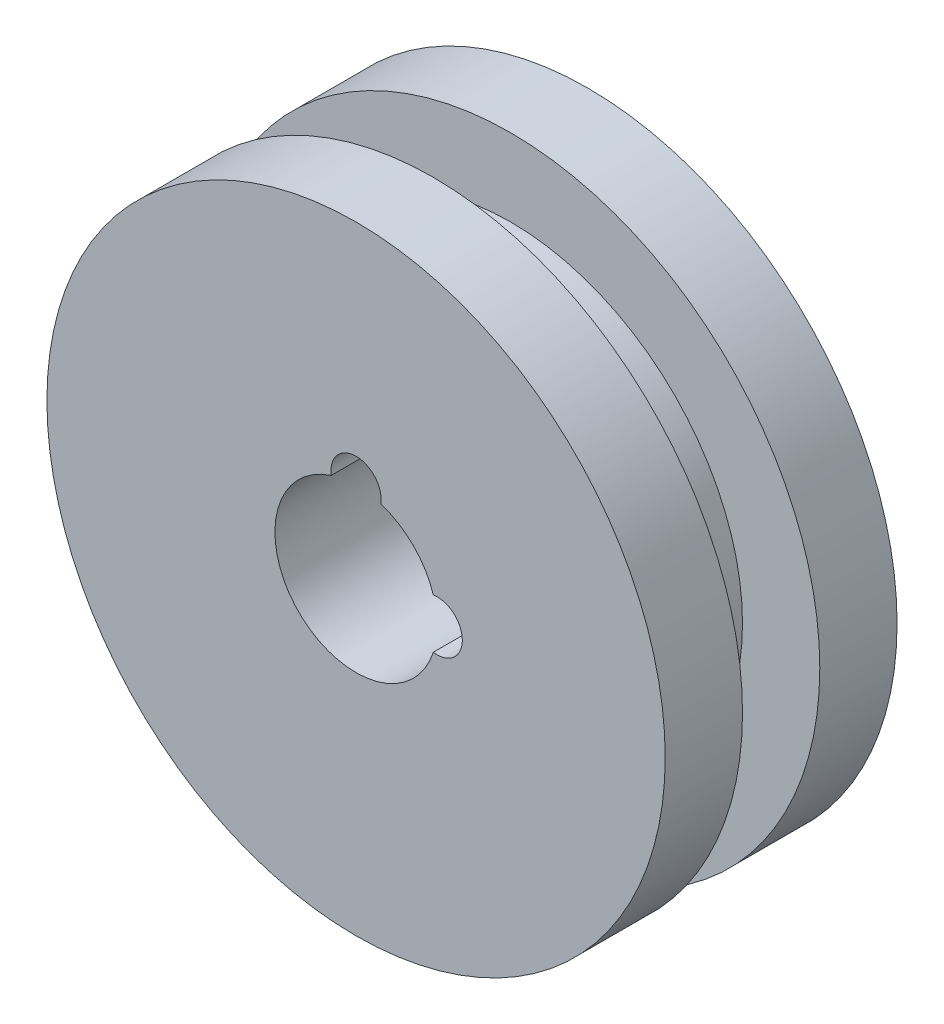
ISO-10303-21;
HEADER;
FILE_DESCRIPTION(('STEP AP214'),'2;1');
FILE_NAME('part.step','',(''),(''),'','','');
FILE_SCHEMA(('AUTOMOTIVE_DESIGN { 1 0 10303 214 1 1 1 1 }'));
ENDSEC;
DATA;
#1=APPLICATION_CONTEXT('core data for automotive mechanical design processes');
#2=APPLICATION_PROTOCOL_DEFINITION('international standard','automotive_design',2000,#1);
#3=PRODUCT_CONTEXT('',#1,'mechanical');
#4=PRODUCT('Part','Part','',(#3));
#5=PRODUCT_RELATED_PRODUCT_CATEGORY('part','',(#4));
#6=PRODUCT_DEFINITION_FORMATION('','',#4);
#7=PRODUCT_DEFINITION_CONTEXT('part definition',#1,'design');
#8=PRODUCT_DEFINITION('design','',#6,#7);
#9=PRODUCT_DEFINITION_SHAPE('','',#8);
#10=(LENGTH_UNIT() NAMED_UNIT(*) SI_UNIT(.MILLI.,.METRE.));
#11=(NAMED_UNIT(*) PLANE_ANGLE_UNIT() SI_UNIT($,.RADIAN.));
#12=(NAMED_UNIT(*) SI_UNIT($,.STERADIAN.) SOLID_ANGLE_UNIT());
#13=UNCERTAINTY_MEASURE_WITH_UNIT(LENGTH_MEASURE(1.E-05),#10,'distance_accuracy_value','');
#14=(GEOMETRIC_REPRESENTATION_CONTEXT(3) GLOBAL_UNCERTAINTY_ASSIGNED_CONTEXT((#13)) GLOBAL_UNIT_ASSIGNED_CONTEXT((#10,
#11,#12)) REPRESENTATION_CONTEXT('',''));
#15=CARTESIAN_POINT('',(0.,0.,0.));
#16=DIRECTION('',(0.,0.,1.));
#17=DIRECTION('',(1.,0.,0.));
#18=AXIS2_PLACEMENT_3D('',#15,#16,#17);
#19=CARTESIAN_POINT('',(0.,0.,3.));
#20=DIRECTION('',(0.,0.,-1.));
#21=DIRECTION('',(-1.,0.,0.));
#22=AXIS2_PLACEMENT_3D('',#19,#20,#21);
#23=CYLINDRICAL_SURFACE('',#22,6.);
#24=CARTESIAN_POINT('',(0.,0.,1.));
#25=DIRECTION('',(0.,0.,1.));
#26=DIRECTION('',(1.,0.,0.));
#27=AXIS2_PLACEMENT_3D('',#24,#25,#26);
#28=CIRCLE('',#27,6.);
#29=CARTESIAN_POINT('',(6.,0.,1.));
#30=VERTEX_POINT('',#29);
#31=EDGE_CURVE('E47',#30,#30,#28,.T.);
#32=ORIENTED_EDGE('',*,*,#31,.F.);
#33=EDGE_LOOP('',(#32));
#34=FACE_BOUND('',#33,.T.);
#35=CARTESIAN_POINT('',(0.,0.,-1.));
#36=DIRECTION('',(0.,0.,-1.));
#37=DIRECTION('',(-1.,0.,0.));
#38=AXIS2_PLACEMENT_3D('',#35,#36,#37);
#39=CIRCLE('',#38,6.);
#40=CARTESIAN_POINT('',(-6.,0.,-1.));
#41=VERTEX_POINT('',#40);
#42=EDGE_CURVE('E11',#41,#41,#39,.T.);
#43=ORIENTED_EDGE('',*,*,#42,.F.);
#44=EDGE_LOOP('',(#43));
#45=FACE_BOUND('',#44,.T.);
#46=ADVANCED_FACE('F39',(#34,#45),#23,.T.);
#47=CARTESIAN_POINT('',(0.,0.,3.));
#48=DIRECTION('',(0.,0.,1.));
#49=DIRECTION('',(1.,0.,0.));
#50=AXIS2_PLACEMENT_3D('',#47,#48,#49);
#51=PLANE('',#50);
#52=CARTESIAN_POINT('',(0.,2.1,3.));
#53=DIRECTION('',(0.,0.,1.));
#54=DIRECTION('',(1.,0.,0.));
#55=AXIS2_PLACEMENT_3D('',#52,#53,#54);
#56=CIRCLE('',#55,0.65);
#57=CARTESIAN_POINT('',(0.642168667931224,1.99940476190476,3.));
#58=VERTEX_POINT('',#57);
#59=CARTESIAN_POINT('',(-0.642168667931224,1.99940476190476,3.));
#60=VERTEX_POINT('',#59);
#61=EDGE_CURVE('E89',#58,#60,#56,.T.);
#62=ORIENTED_EDGE('',*,*,#61,.F.);
#63=CARTESIAN_POINT('',(0.,0.,3.));
#64=DIRECTION('',(0.,0.,1.));
#65=DIRECTION('',(1.,0.,0.));
#66=AXIS2_PLACEMENT_3D('',#63,#64,#65);
#67=CIRCLE('',#66,2.1);
#68=CARTESIAN_POINT('',(1.99940476190476,0.642168667931224,3.));
#69=VERTEX_POINT('',#68);
#70=EDGE_CURVE('E80',#69,#58,#67,.T.);
#71=ORIENTED_EDGE('',*,*,#70,.F.);
#72=CARTESIAN_POINT('',(2.1,0.,3.));
#73=DIRECTION('',(0.,0.,1.));
#74=DIRECTION('',(1.,0.,0.));
#75=AXIS2_PLACEMENT_3D('',#72,#73,#74);
#76=CIRCLE('',#75,0.65);
#77=CARTESIAN_POINT('',(1.99940476190476,-0.642168667931224,3.));
#78=VERTEX_POINT('',#77);
#79=EDGE_CURVE('E107',#78,#69,#76,.T.);
#80=ORIENTED_EDGE('',*,*,#79,.F.);
#81=CARTESIAN_POINT('',(0.,0.,3.));
#82=DIRECTION('',(0.,0.,1.));
#83=DIRECTION('',(1.,0.,0.));
#84=AXIS2_PLACEMENT_3D('',#81,#82,#83);
#85=CIRCLE('',#84,2.1);
#86=EDGE_CURVE('E103',#60,#78,#85,.T.);
#87=ORIENTED_EDGE('',*,*,#86,.F.);
#88=EDGE_LOOP('',(#62,#71,#80,#87));
#89=FACE_BOUND('',#88,.T.);
#90=CARTESIAN_POINT('',(0.,0.,3.));
#91=DIRECTION('',(0.,0.,1.));
#92=DIRECTION('',(1.,0.,0.));
#93=AXIS2_PLACEMENT_3D('',#90,#91,#92);
#94=CIRCLE('',#93,8.);
#95=CARTESIAN_POINT('',(8.,0.,3.));
#96=VERTEX_POINT('',#95);
#97=EDGE_CURVE('E185',#96,#96,#94,.T.);
#98=ORIENTED_EDGE('',*,*,#97,.T.);
#99=EDGE_LOOP('',(#98));
#100=FACE_BOUND('',#99,.T.);
#101=ADVANCED_FACE('F101',(#89,#100),#51,.T.);
#102=CARTESIAN_POINT('',(0.,0.,-3.));
#103=DIRECTION('',(0.,0.,1.));
#104=DIRECTION('',(1.,0.,0.));
#105=AXIS2_PLACEMENT_3D('',#102,#103,#104);
#106=PLANE('',#105);
#107=CARTESIAN_POINT('',(0.,0.,-3.));
#108=DIRECTION('',(0.,0.,1.));
#109=DIRECTION('',(1.,0.,0.));
#110=AXIS2_PLACEMENT_3D('',#107,#108,#109);
#111=CIRCLE('',#110,2.1);
#112=CARTESIAN_POINT('',(1.99940476190476,0.642168667931224,-3.));
#113=VERTEX_POINT('',#112);
#114=CARTESIAN_POINT('',(0.642168667931224,1.99940476190476,-3.));
#115=VERTEX_POINT('',#114);
#116=EDGE_CURVE('E62',#113,#115,#111,.T.);
#117=ORIENTED_EDGE('',*,*,#116,.T.);
#118=CARTESIAN_POINT('',(0.,2.1,-3.));
#119=DIRECTION('',(0.,0.,1.));
#120=DIRECTION('',(1.,0.,0.));
#121=AXIS2_PLACEMENT_3D('',#118,#119,#120);
#122=CIRCLE('',#121,0.65);
#123=CARTESIAN_POINT('',(-0.642168667931224,1.99940476190476,-3.));
#124=VERTEX_POINT('',#123);
#125=EDGE_CURVE('E96',#115,#124,#122,.T.);
#126=ORIENTED_EDGE('',*,*,#125,.T.);
#127=CARTESIAN_POINT('',(0.,0.,-3.));
#128=DIRECTION('',(0.,0.,1.));
#129=DIRECTION('',(1.,0.,0.));
#130=AXIS2_PLACEMENT_3D('',#127,#128,#129);
#131=CIRCLE('',#130,2.1);
#132=CARTESIAN_POINT('',(1.99940476190476,-0.642168667931224,-3.));
#133=VERTEX_POINT('',#132);
#134=EDGE_CURVE('E118',#124,#133,#131,.T.);
#135=ORIENTED_EDGE('',*,*,#134,.T.);
#136=CARTESIAN_POINT('',(2.1,0.,-3.));
#137=DIRECTION('',(0.,0.,1.));
#138=DIRECTION('',(1.,0.,0.));
#139=AXIS2_PLACEMENT_3D('',#136,#137,#138);
#140=CIRCLE('',#139,0.65);
#141=EDGE_CURVE('E90',#133,#113,#140,.T.);
#142=ORIENTED_EDGE('',*,*,#141,.T.);
#143=EDGE_LOOP('',(#117,#126,#135,#142));
#144=FACE_BOUND('',#143,.T.);
#145=CARTESIAN_POINT('',(0.,0.,-3.));
#146=DIRECTION('',(0.,0.,1.));
#147=DIRECTION('',(1.,0.,0.));
#148=AXIS2_PLACEMENT_3D('',#145,#146,#147);
#149=CIRCLE('',#148,8.);
#150=CARTESIAN_POINT('',(8.,0.,-3.));
#151=VERTEX_POINT('',#150);
#152=EDGE_CURVE('E179',#151,#151,#149,.T.);
#153=ORIENTED_EDGE('',*,*,#152,.F.);
#154=EDGE_LOOP('',(#153));
#155=FACE_BOUND('',#154,.T.);
#156=ADVANCED_FACE('F170',(#144,#155),#106,.F.);
#157=CARTESIAN_POINT('',(0.,0.,3.));
#158=DIRECTION('',(0.,0.,-1.));
#159=DIRECTION('',(-1.,0.,0.));
#160=AXIS2_PLACEMENT_3D('',#157,#158,#159);
#161=CYLINDRICAL_SURFACE('',#160,2.1);
#162=ORIENTED_EDGE('',*,*,#116,.F.);
#163=DIRECTION('',(0.,0.,-1.));
#164=VECTOR('',#163,1.);
#165=CARTESIAN_POINT('',(1.99940476190476,0.642168667931224,3.));
#166=LINE('',#165,#164);
#167=EDGE_CURVE('E84',#69,#113,#166,.T.);
#168=ORIENTED_EDGE('',*,*,#167,.F.);
#169=ORIENTED_EDGE('',*,*,#70,.T.);
#170=DIRECTION('',(0.,0.,-1.));
#171=VECTOR('',#170,1.);
#172=CARTESIAN_POINT('',(0.642168667931224,1.99940476190476,3.));
#173=LINE('',#172,#171);
#174=EDGE_CURVE('E83',#58,#115,#173,.T.);
#175=ORIENTED_EDGE('',*,*,#174,.T.);
#176=EDGE_LOOP('',(#162,#168,#169,#175));
#177=FACE_BOUND('',#176,.T.);
#178=ADVANCED_FACE('F82',(#177),#161,.F.);
#179=CARTESIAN_POINT('',(0.,2.1,3.));
#180=DIRECTION('',(0.,0.,-1.));
#181=DIRECTION('',(-1.,0.,0.));
#182=AXIS2_PLACEMENT_3D('',#179,#180,#181);
#183=CYLINDRICAL_SURFACE('',#182,0.65);
#184=ORIENTED_EDGE('',*,*,#125,.F.);
#185=ORIENTED_EDGE('',*,*,#174,.F.);
#186=ORIENTED_EDGE('',*,*,#61,.T.);
#187=DIRECTION('',(0.,0.,-1.));
#188=VECTOR('',#187,1.);
#189=CARTESIAN_POINT('',(-0.642168667931224,1.99940476190476,3.));
#190=LINE('',#189,#188);
#191=EDGE_CURVE('E98',#60,#124,#190,.T.);
#192=ORIENTED_EDGE('',*,*,#191,.T.);
#193=EDGE_LOOP('',(#184,#185,#186,#192));
#194=FACE_BOUND('',#193,.T.);
#195=ADVANCED_FACE('F93',(#194),#183,.F.);
#196=CARTESIAN_POINT('',(0.,0.,3.));
#197=DIRECTION('',(0.,0.,-1.));
#198=DIRECTION('',(-1.,0.,0.));
#199=AXIS2_PLACEMENT_3D('',#196,#197,#198);
#200=CYLINDRICAL_SURFACE('',#199,2.1);
#201=ORIENTED_EDGE('',*,*,#134,.F.);
#202=ORIENTED_EDGE('',*,*,#191,.F.);
#203=ORIENTED_EDGE('',*,*,#86,.T.);
#204=DIRECTION('',(0.,0.,-1.));
#205=VECTOR('',#204,1.);
#206=CARTESIAN_POINT('',(1.99940476190476,-0.642168667931224,3.));
#207=LINE('',#206,#205);
#208=EDGE_CURVE('E54',#78,#133,#207,.T.);
#209=ORIENTED_EDGE('',*,*,#208,.T.);
#210=EDGE_LOOP('',(#201,#202,#203,#209));
#211=FACE_BOUND('',#210,.T.);
#212=ADVANCED_FACE('F162',(#211),#200,.F.);
#213=CARTESIAN_POINT('',(2.1,0.,3.));
#214=DIRECTION('',(0.,0.,-1.));
#215=DIRECTION('',(-1.,0.,0.));
#216=AXIS2_PLACEMENT_3D('',#213,#214,#215);
#217=CYLINDRICAL_SURFACE('',#216,0.65);
#218=ORIENTED_EDGE('',*,*,#141,.F.);
#219=ORIENTED_EDGE('',*,*,#208,.F.);
#220=ORIENTED_EDGE('',*,*,#79,.T.);
#221=ORIENTED_EDGE('',*,*,#167,.T.);
#222=EDGE_LOOP('',(#218,#219,#220,#221));
#223=FACE_BOUND('',#222,.T.);
#224=ADVANCED_FACE('F158',(#223),#217,.F.);
#225=CARTESIAN_POINT('',(0.,0.,1.));
#226=DIRECTION('',(0.,0.,1.));
#227=DIRECTION('',(1.,0.,0.));
#228=AXIS2_PLACEMENT_3D('',#225,#226,#227);
#229=CYLINDRICAL_SURFACE('',#228,8.);
#230=CARTESIAN_POINT('',(0.,0.,1.));
#231=DIRECTION('',(0.,0.,1.));
#232=DIRECTION('',(1.,0.,0.));
#233=AXIS2_PLACEMENT_3D('',#230,#231,#232);
#234=CIRCLE('',#233,8.);
#235=CARTESIAN_POINT('',(8.,0.,1.));
#236=VERTEX_POINT('',#235);
#237=EDGE_CURVE('E115',#236,#236,#234,.T.);
#238=ORIENTED_EDGE('',*,*,#237,.T.);
#239=EDGE_LOOP('',(#238));
#240=FACE_BOUND('',#239,.T.);
#241=ORIENTED_EDGE('',*,*,#97,.F.);
#242=EDGE_LOOP('',(#241));
#243=FACE_BOUND('',#242,.T.);
#244=ADVANCED_FACE('F152',(#240,#243),#229,.T.);
#245=CARTESIAN_POINT('',(0.,0.,1.));
#246=DIRECTION('',(0.,0.,1.));
#247=DIRECTION('',(1.,0.,0.));
#248=AXIS2_PLACEMENT_3D('',#245,#246,#247);
#249=PLANE('',#248);
#250=ORIENTED_EDGE('',*,*,#31,.T.);
#251=EDGE_LOOP('',(#250));
#252=FACE_BOUND('',#251,.T.);
#253=ORIENTED_EDGE('',*,*,#237,.F.);
#254=EDGE_LOOP('',(#253));
#255=FACE_BOUND('',#254,.T.);
#256=ADVANCED_FACE('F134',(#252,#255),#249,.F.);
#257=CARTESIAN_POINT('',(0.,0.,-1.));
#258=DIRECTION('',(0.,0.,-1.));
#259=DIRECTION('',(1.,0.,0.));
#260=AXIS2_PLACEMENT_3D('',#257,#258,#259);
#261=PLANE('',#260);
#262=CARTESIAN_POINT('',(0.,0.,-1.));
#263=DIRECTION('',(0.,0.,1.));
#264=DIRECTION('',(1.,0.,0.));
#265=AXIS2_PLACEMENT_3D('',#262,#263,#264);
#266=CIRCLE('',#265,8.);
#267=CARTESIAN_POINT('',(8.,0.,-1.));
#268=VERTEX_POINT('',#267);
#269=EDGE_CURVE('E182',#268,#268,#266,.T.);
#270=ORIENTED_EDGE('',*,*,#269,.T.);
#271=EDGE_LOOP('',(#270));
#272=FACE_BOUND('',#271,.T.);
#273=ORIENTED_EDGE('',*,*,#42,.T.);
#274=EDGE_LOOP('',(#273));
#275=FACE_BOUND('',#274,.T.);
#276=ADVANCED_FACE('F141',(#272,#275),#261,.F.);
#277=CARTESIAN_POINT('',(0.,0.,-1.));
#278=DIRECTION('',(0.,0.,-1.));
#279=DIRECTION('',(-1.,0.,0.));
#280=AXIS2_PLACEMENT_3D('',#277,#278,#279);
#281=CYLINDRICAL_SURFACE('',#280,8.);
#282=ORIENTED_EDGE('',*,*,#269,.F.);
#283=EDGE_LOOP('',(#282));
#284=FACE_BOUND('',#283,.T.);
#285=ORIENTED_EDGE('',*,*,#152,.T.);
#286=EDGE_LOOP('',(#285));
#287=FACE_BOUND('',#286,.T.);
#288=ADVANCED_FACE('F143',(#284,#287),#281,.T.);
#289=CLOSED_SHELL('',(#46,#101,#156,#178,#195,#212,#224,#244,#256,#276,#288));
#290=MANIFOLD_SOLID_BREP('B2',#289);
#291=ADVANCED_BREP_SHAPE_REPRESENTATION('',(#18,#290),#14);
#292=SHAPE_DEFINITION_REPRESENTATION(#9,#291);
ENDSEC;
END-ISO-10303-21;
